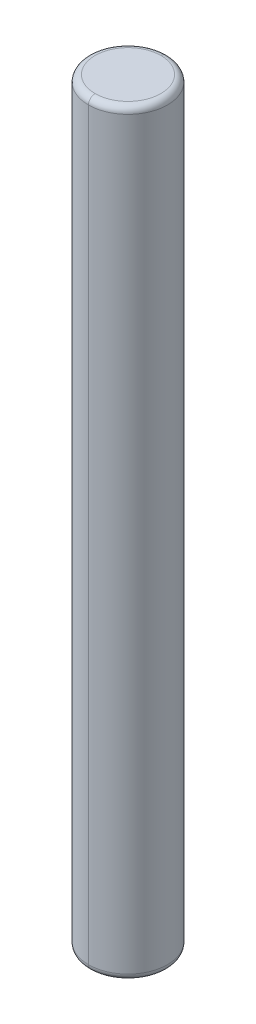
ISO-10303-21;
HEADER;
FILE_DESCRIPTION(('STEP AP214'),'2;1');
FILE_NAME('part.step','',(''),(''),'','','');
FILE_SCHEMA(('AUTOMOTIVE_DESIGN { 1 0 10303 214 1 1 1 1 }'));
ENDSEC;
DATA;
#1=APPLICATION_CONTEXT('core data for automotive mechanical design processes');
#2=APPLICATION_PROTOCOL_DEFINITION('international standard','automotive_design',2000,#1);
#3=PRODUCT_CONTEXT('',#1,'mechanical');
#4=PRODUCT('Part','Part','',(#3));
#5=PRODUCT_RELATED_PRODUCT_CATEGORY('part','',(#4));
#6=PRODUCT_DEFINITION_FORMATION('','',#4);
#7=PRODUCT_DEFINITION_CONTEXT('part definition',#1,'design');
#8=PRODUCT_DEFINITION('design','',#6,#7);
#9=PRODUCT_DEFINITION_SHAPE('','',#8);
#10=(LENGTH_UNIT() NAMED_UNIT(*) SI_UNIT(.MILLI.,.METRE.));
#11=(NAMED_UNIT(*) PLANE_ANGLE_UNIT() SI_UNIT($,.RADIAN.));
#12=(NAMED_UNIT(*) SI_UNIT($,.STERADIAN.) SOLID_ANGLE_UNIT());
#13=UNCERTAINTY_MEASURE_WITH_UNIT(LENGTH_MEASURE(1.E-05),#10,'distance_accuracy_value','');
#14=(GEOMETRIC_REPRESENTATION_CONTEXT(3) GLOBAL_UNCERTAINTY_ASSIGNED_CONTEXT((#13)) GLOBAL_UNIT_ASSIGNED_CONTEXT((#10,
#11,#12)) REPRESENTATION_CONTEXT('',''));
#15=CARTESIAN_POINT('',(0.,0.,0.));
#16=DIRECTION('',(0.,0.,1.));
#17=DIRECTION('',(1.,0.,0.));
#18=AXIS2_PLACEMENT_3D('',#15,#16,#17);
#19=CARTESIAN_POINT('',(0.,11.4,0.));
#20=DIRECTION('',(0.,1.,0.));
#21=DIRECTION('',(0.,0.,1.));
#22=AXIS2_PLACEMENT_3D('',#19,#20,#21);
#23=TOROIDAL_SURFACE('',#22,0.5,0.1);
#24=CARTESIAN_POINT('',(0.,11.4,0.));
#25=DIRECTION('',(0.,-1.,0.));
#26=DIRECTION('',(0.,0.,1.));
#27=AXIS2_PLACEMENT_3D('',#24,#25,#26);
#28=CIRCLE('',#27,0.6);
#29=CARTESIAN_POINT('',(0.,11.4,-0.6));
#30=VERTEX_POINT('',#29);
#31=CARTESIAN_POINT('',(0.,11.4,0.6));
#32=VERTEX_POINT('',#31);
#33=EDGE_CURVE('E109',#30,#32,#28,.T.);
#34=ORIENTED_EDGE('',*,*,#33,.F.);
#35=CARTESIAN_POINT('',(0.,11.4,-0.5));
#36=DIRECTION('',(1.,0.,0.));
#37=DIRECTION('',(0.,0.,-1.));
#38=AXIS2_PLACEMENT_3D('',#35,#36,#37);
#39=CIRCLE('',#38,0.1);
#40=CARTESIAN_POINT('',(0.,11.5,-0.5));
#41=VERTEX_POINT('',#40);
#42=EDGE_CURVE('E11',#30,#41,#39,.T.);
#43=ORIENTED_EDGE('',*,*,#42,.T.);
#44=CARTESIAN_POINT('',(0.,11.5,0.));
#45=DIRECTION('',(0.,1.,0.));
#46=DIRECTION('',(0.,0.,1.));
#47=AXIS2_PLACEMENT_3D('',#44,#45,#46);
#48=CIRCLE('',#47,0.5);
#49=CARTESIAN_POINT('',(0.,11.5,0.5));
#50=VERTEX_POINT('',#49);
#51=EDGE_CURVE('E103',#50,#41,#48,.T.);
#52=ORIENTED_EDGE('',*,*,#51,.F.);
#53=CARTESIAN_POINT('',(0.,11.4,0.5));
#54=DIRECTION('',(-1.,0.,0.));
#55=DIRECTION('',(0.,0.,1.));
#56=AXIS2_PLACEMENT_3D('',#53,#54,#55);
#57=CIRCLE('',#56,0.1);
#58=EDGE_CURVE('E87',#32,#50,#57,.T.);
#59=ORIENTED_EDGE('',*,*,#58,.F.);
#60=EDGE_LOOP('',(#34,#43,#52,#59));
#61=FACE_BOUND('',#60,.T.);
#62=ADVANCED_FACE('F17',(#61),#23,.T.);
#63=CARTESIAN_POINT('',(0.,0.1,0.));
#64=DIRECTION('',(0.,1.,0.));
#65=DIRECTION('',(0.,0.,1.));
#66=AXIS2_PLACEMENT_3D('',#63,#64,#65);
#67=TOROIDAL_SURFACE('',#66,0.5,0.1);
#68=CARTESIAN_POINT('',(0.,0.,0.));
#69=DIRECTION('',(0.,-1.,0.));
#70=DIRECTION('',(0.,0.,1.));
#71=AXIS2_PLACEMENT_3D('',#68,#69,#70);
#72=CIRCLE('',#71,0.5);
#73=CARTESIAN_POINT('',(0.,0.,-0.5));
#74=VERTEX_POINT('',#73);
#75=CARTESIAN_POINT('',(0.,0.,0.5));
#76=VERTEX_POINT('',#75);
#77=EDGE_CURVE('E21',#74,#76,#72,.T.);
#78=ORIENTED_EDGE('',*,*,#77,.F.);
#79=CARTESIAN_POINT('',(0.,0.1,-0.5));
#80=DIRECTION('',(1.,0.,0.));
#81=DIRECTION('',(0.,0.,-1.));
#82=AXIS2_PLACEMENT_3D('',#79,#80,#81);
#83=CIRCLE('',#82,0.1);
#84=CARTESIAN_POINT('',(0.,0.1,-0.6));
#85=VERTEX_POINT('',#84);
#86=EDGE_CURVE('E28',#74,#85,#83,.T.);
#87=ORIENTED_EDGE('',*,*,#86,.T.);
#88=CARTESIAN_POINT('',(0.,0.1,0.));
#89=DIRECTION('',(0.,1.,0.));
#90=DIRECTION('',(0.,0.,1.));
#91=AXIS2_PLACEMENT_3D('',#88,#89,#90);
#92=CIRCLE('',#91,0.6);
#93=CARTESIAN_POINT('',(0.,0.1,0.6));
#94=VERTEX_POINT('',#93);
#95=EDGE_CURVE('E84',#94,#85,#92,.T.);
#96=ORIENTED_EDGE('',*,*,#95,.F.);
#97=CARTESIAN_POINT('',(0.,0.1,0.5));
#98=DIRECTION('',(-1.,0.,0.));
#99=DIRECTION('',(0.,0.,1.));
#100=AXIS2_PLACEMENT_3D('',#97,#98,#99);
#101=CIRCLE('',#100,0.1);
#102=EDGE_CURVE('E76',#76,#94,#101,.T.);
#103=ORIENTED_EDGE('',*,*,#102,.F.);
#104=EDGE_LOOP('',(#78,#87,#96,#103));
#105=FACE_BOUND('',#104,.T.);
#106=ADVANCED_FACE('F19',(#105),#67,.T.);
#107=CARTESIAN_POINT('',(0.,11.5,0.));
#108=DIRECTION('',(0.,-1.,0.));
#109=DIRECTION('',(0.,0.,-1.));
#110=AXIS2_PLACEMENT_3D('',#107,#108,#109);
#111=CYLINDRICAL_SURFACE('',#110,0.6);
#112=ORIENTED_EDGE('',*,*,#33,.T.);
#113=DIRECTION('',(0.,-1.,0.));
#114=VECTOR('',#113,1.);
#115=CARTESIAN_POINT('',(0.,11.5,0.6));
#116=LINE('',#115,#114);
#117=EDGE_CURVE('E106',#32,#94,#116,.T.);
#118=ORIENTED_EDGE('',*,*,#117,.T.);
#119=ORIENTED_EDGE('',*,*,#95,.T.);
#120=DIRECTION('',(0.,-1.,0.));
#121=VECTOR('',#120,1.);
#122=CARTESIAN_POINT('',(0.,11.5,-0.6));
#123=LINE('',#122,#121);
#124=EDGE_CURVE('E43',#30,#85,#123,.T.);
#125=ORIENTED_EDGE('',*,*,#124,.F.);
#126=EDGE_LOOP('',(#112,#118,#119,#125));
#127=FACE_BOUND('',#126,.T.);
#128=ADVANCED_FACE('F172',(#127),#111,.T.);
#129=CARTESIAN_POINT('',(0.,11.5,0.));
#130=DIRECTION('',(0.,-1.,0.));
#131=DIRECTION('',(0.,0.,-1.));
#132=AXIS2_PLACEMENT_3D('',#129,#130,#131);
#133=CYLINDRICAL_SURFACE('',#132,0.6);
#134=ORIENTED_EDGE('',*,*,#117,.F.);
#135=CARTESIAN_POINT('',(0.,11.4,0.));
#136=DIRECTION('',(0.,-1.,0.));
#137=DIRECTION('',(0.,0.,1.));
#138=AXIS2_PLACEMENT_3D('',#135,#136,#137);
#139=CIRCLE('',#138,0.6);
#140=EDGE_CURVE('E115',#32,#30,#139,.T.);
#141=ORIENTED_EDGE('',*,*,#140,.T.);
#142=ORIENTED_EDGE('',*,*,#124,.T.);
#143=CARTESIAN_POINT('',(0.,0.1,0.));
#144=DIRECTION('',(0.,1.,0.));
#145=DIRECTION('',(0.,0.,1.));
#146=AXIS2_PLACEMENT_3D('',#143,#144,#145);
#147=CIRCLE('',#146,0.6);
#148=EDGE_CURVE('E112',#85,#94,#147,.T.);
#149=ORIENTED_EDGE('',*,*,#148,.T.);
#150=EDGE_LOOP('',(#134,#141,#142,#149));
#151=FACE_BOUND('',#150,.T.);
#152=ADVANCED_FACE('F135',(#151),#133,.T.);
#153=CARTESIAN_POINT('',(0.,11.5,0.));
#154=DIRECTION('',(0.,1.,0.));
#155=DIRECTION('',(1.,0.,0.));
#156=AXIS2_PLACEMENT_3D('',#153,#154,#155);
#157=PLANE('',#156);
#158=ORIENTED_EDGE('',*,*,#51,.T.);
#159=CARTESIAN_POINT('',(0.,11.5,0.));
#160=DIRECTION('',(0.,1.,0.));
#161=DIRECTION('',(0.,0.,1.));
#162=AXIS2_PLACEMENT_3D('',#159,#160,#161);
#163=CIRCLE('',#162,0.5);
#164=EDGE_CURVE('E96',#41,#50,#163,.T.);
#165=ORIENTED_EDGE('',*,*,#164,.T.);
#166=EDGE_LOOP('',(#158,#165));
#167=FACE_BOUND('',#166,.T.);
#168=ADVANCED_FACE('F171',(#167),#157,.T.);
#169=CARTESIAN_POINT('',(0.,0.,0.));
#170=DIRECTION('',(0.,1.,0.));
#171=DIRECTION('',(1.,0.,0.));
#172=AXIS2_PLACEMENT_3D('',#169,#170,#171);
#173=PLANE('',#172);
#174=CARTESIAN_POINT('',(0.,0.,0.));
#175=DIRECTION('',(0.,-1.,0.));
#176=DIRECTION('',(0.,0.,1.));
#177=AXIS2_PLACEMENT_3D('',#174,#175,#176);
#178=CIRCLE('',#177,0.5);
#179=EDGE_CURVE('E92',#76,#74,#178,.T.);
#180=ORIENTED_EDGE('',*,*,#179,.T.);
#181=ORIENTED_EDGE('',*,*,#77,.T.);
#182=EDGE_LOOP('',(#180,#181));
#183=FACE_BOUND('',#182,.T.);
#184=ADVANCED_FACE('F91',(#183),#173,.F.);
#185=CARTESIAN_POINT('',(0.,0.1,0.));
#186=DIRECTION('',(0.,1.,0.));
#187=DIRECTION('',(0.,0.,1.));
#188=AXIS2_PLACEMENT_3D('',#185,#186,#187);
#189=TOROIDAL_SURFACE('',#188,0.5,0.1);
#190=ORIENTED_EDGE('',*,*,#86,.F.);
#191=ORIENTED_EDGE('',*,*,#179,.F.);
#192=ORIENTED_EDGE('',*,*,#102,.T.);
#193=ORIENTED_EDGE('',*,*,#148,.F.);
#194=EDGE_LOOP('',(#190,#191,#192,#193));
#195=FACE_BOUND('',#194,.T.);
#196=ADVANCED_FACE('F94',(#195),#189,.T.);
#197=CARTESIAN_POINT('',(0.,11.4,0.));
#198=DIRECTION('',(0.,1.,0.));
#199=DIRECTION('',(0.,0.,1.));
#200=AXIS2_PLACEMENT_3D('',#197,#198,#199);
#201=TOROIDAL_SURFACE('',#200,0.5,0.1);
#202=ORIENTED_EDGE('',*,*,#42,.F.);
#203=ORIENTED_EDGE('',*,*,#140,.F.);
#204=ORIENTED_EDGE('',*,*,#58,.T.);
#205=ORIENTED_EDGE('',*,*,#164,.F.);
#206=EDGE_LOOP('',(#202,#203,#204,#205));
#207=FACE_BOUND('',#206,.T.);
#208=ADVANCED_FACE('F139',(#207),#201,.T.);
#209=CLOSED_SHELL('',(#62,#106,#128,#152,#168,#184,#196,#208));
#210=MANIFOLD_SOLID_BREP('B1',#209);
#211=ADVANCED_BREP_SHAPE_REPRESENTATION('',(#18,#210),#14);
#212=SHAPE_DEFINITION_REPRESENTATION(#9,#211);
ENDSEC;
END-ISO-10303-21;
